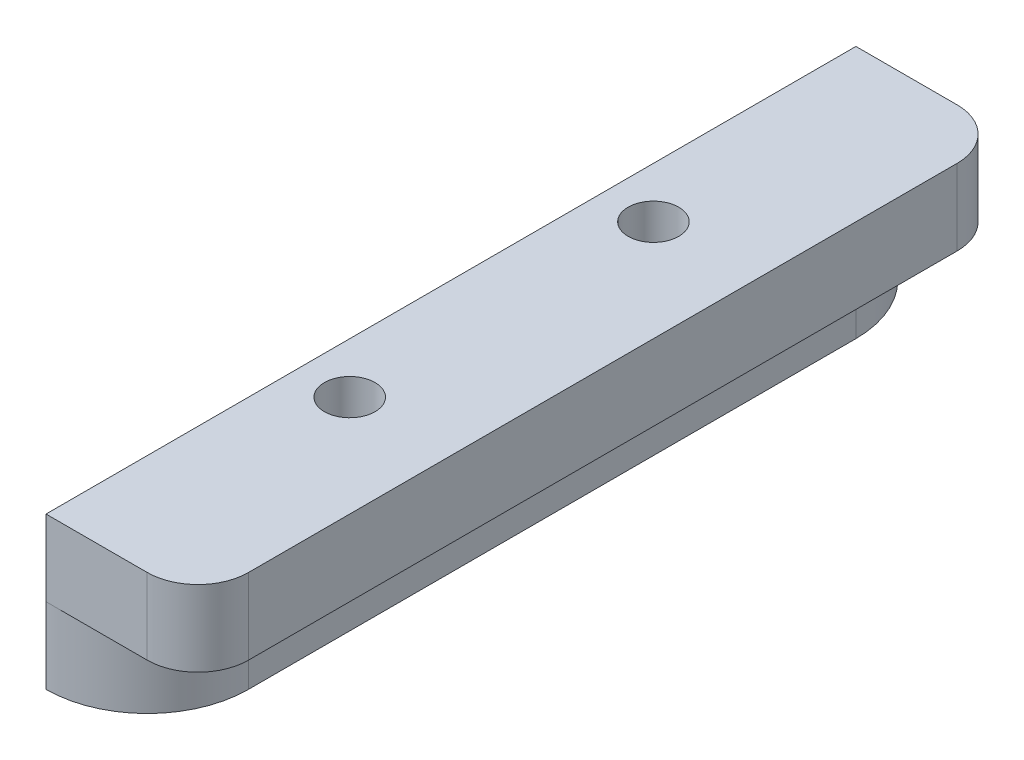
ISO-10303-21;
HEADER;
FILE_DESCRIPTION(('STEP AP214'),'2;1');
FILE_NAME('part.step','',(''),(''),'','','');
FILE_SCHEMA(('AUTOMOTIVE_DESIGN { 1 0 10303 214 1 1 1 1 }'));
ENDSEC;
DATA;
#1=APPLICATION_CONTEXT('core data for automotive mechanical design processes');
#2=APPLICATION_PROTOCOL_DEFINITION('international standard','automotive_design',2000,#1);
#3=PRODUCT_CONTEXT('',#1,'mechanical');
#4=PRODUCT('Part','Part','',(#3));
#5=PRODUCT_RELATED_PRODUCT_CATEGORY('part','',(#4));
#6=PRODUCT_DEFINITION_FORMATION('','',#4);
#7=PRODUCT_DEFINITION_CONTEXT('part definition',#1,'design');
#8=PRODUCT_DEFINITION('design','',#6,#7);
#9=PRODUCT_DEFINITION_SHAPE('','',#8);
#10=(LENGTH_UNIT() NAMED_UNIT(*) SI_UNIT(.MILLI.,.METRE.));
#11=(NAMED_UNIT(*) PLANE_ANGLE_UNIT() SI_UNIT($,.RADIAN.));
#12=(NAMED_UNIT(*) SI_UNIT($,.STERADIAN.) SOLID_ANGLE_UNIT());
#13=UNCERTAINTY_MEASURE_WITH_UNIT(LENGTH_MEASURE(1.E-05),#10,'distance_accuracy_value','');
#14=(GEOMETRIC_REPRESENTATION_CONTEXT(3) GLOBAL_UNCERTAINTY_ASSIGNED_CONTEXT((#13)) GLOBAL_UNIT_ASSIGNED_CONTEXT((#10,
#11,#12)) REPRESENTATION_CONTEXT('',''));
#15=CARTESIAN_POINT('',(0.,0.,0.));
#16=DIRECTION('',(0.,0.,1.));
#17=DIRECTION('',(1.,0.,0.));
#18=AXIS2_PLACEMENT_3D('',#15,#16,#17);
#19=CARTESIAN_POINT('',(-9.525,9.525,50.8));
#20=DIRECTION('',(0.,0.,-1.));
#21=DIRECTION('',(-1.,0.,0.));
#22=AXIS2_PLACEMENT_3D('',#19,#20,#21);
#23=PLANE('',#22);
#24=DIRECTION('',(-1.,0.,0.));
#25=VECTOR('',#24,1.);
#26=CARTESIAN_POINT('',(3.175,0.,50.8));
#27=LINE('',#26,#25);
#28=CARTESIAN_POINT('',(3.175,0.,50.8));
#29=VERTEX_POINT('',#28);
#30=CARTESIAN_POINT('',(-9.525,0.,50.8));
#31=VERTEX_POINT('',#30);
#32=EDGE_CURVE('E179',#29,#31,#27,.T.);
#33=ORIENTED_EDGE('',*,*,#32,.F.);
#34=DIRECTION('',(0.,-1.,0.));
#35=VECTOR('',#34,1.);
#36=CARTESIAN_POINT('',(3.175,9.525,50.8));
#37=LINE('',#36,#35);
#38=CARTESIAN_POINT('',(3.175,9.525,50.8));
#39=VERTEX_POINT('',#38);
#40=EDGE_CURVE('E11',#29,#39,#37,.F.);
#41=ORIENTED_EDGE('',*,*,#40,.T.);
#42=DIRECTION('',(1.,0.,0.));
#43=VECTOR('',#42,1.);
#44=CARTESIAN_POINT('',(-9.525,9.525,50.8));
#45=LINE('',#44,#43);
#46=CARTESIAN_POINT('',(-9.525,9.525,50.8));
#47=VERTEX_POINT('',#46);
#48=EDGE_CURVE('E146',#47,#39,#45,.T.);
#49=ORIENTED_EDGE('',*,*,#48,.F.);
#50=DIRECTION('',(0.,-1.,0.));
#51=VECTOR('',#50,1.);
#52=CARTESIAN_POINT('',(-9.525,9.525,50.8));
#53=LINE('',#52,#51);
#54=EDGE_CURVE('E137',#47,#31,#53,.T.);
#55=ORIENTED_EDGE('',*,*,#54,.T.);
#56=EDGE_LOOP('',(#33,#41,#49,#55));
#57=FACE_BOUND('',#56,.T.);
#58=ADVANCED_FACE('F37',(#57),#23,.F.);
#59=CARTESIAN_POINT('',(9.525,9.525,50.8));
#60=DIRECTION('',(-1.,0.,0.));
#61=DIRECTION('',(0.,0.,1.));
#62=AXIS2_PLACEMENT_3D('',#59,#60,#61);
#63=PLANE('',#62);
#64=DIRECTION('',(0.,0.,1.));
#65=VECTOR('',#64,1.);
#66=CARTESIAN_POINT('',(9.525,0.,-50.8));
#67=LINE('',#66,#65);
#68=CARTESIAN_POINT('',(9.525,0.,-44.45));
#69=VERTEX_POINT('',#68);
#70=CARTESIAN_POINT('',(9.525,0.,44.45));
#71=VERTEX_POINT('',#70);
#72=EDGE_CURVE('E180',#69,#71,#67,.T.);
#73=ORIENTED_EDGE('',*,*,#72,.F.);
#74=DIRECTION('',(0.,-1.,0.));
#75=VECTOR('',#74,1.);
#76=CARTESIAN_POINT('',(9.525,9.525,-44.45));
#77=LINE('',#76,#75);
#78=CARTESIAN_POINT('',(9.525,9.525,-44.45));
#79=VERTEX_POINT('',#78);
#80=EDGE_CURVE('E58',#69,#79,#77,.F.);
#81=ORIENTED_EDGE('',*,*,#80,.T.);
#82=DIRECTION('',(0.,0.,-1.));
#83=VECTOR('',#82,1.);
#84=CARTESIAN_POINT('',(9.525,9.525,50.8));
#85=LINE('',#84,#83);
#86=CARTESIAN_POINT('',(9.525,9.525,44.45));
#87=VERTEX_POINT('',#86);
#88=EDGE_CURVE('E131',#87,#79,#85,.T.);
#89=ORIENTED_EDGE('',*,*,#88,.F.);
#90=DIRECTION('',(0.,-1.,0.));
#91=VECTOR('',#90,1.);
#92=CARTESIAN_POINT('',(9.525,9.525,44.45));
#93=LINE('',#92,#91);
#94=EDGE_CURVE('E167',#87,#71,#93,.T.);
#95=ORIENTED_EDGE('',*,*,#94,.T.);
#96=EDGE_LOOP('',(#73,#81,#89,#95));
#97=FACE_BOUND('',#96,.T.);
#98=ADVANCED_FACE('F175',(#97),#63,.F.);
#99=CARTESIAN_POINT('',(-9.525,9.525,-50.8));
#100=DIRECTION('',(0.,0.,-1.));
#101=DIRECTION('',(-1.,0.,0.));
#102=AXIS2_PLACEMENT_3D('',#99,#100,#101);
#103=PLANE('',#102);
#104=DIRECTION('',(1.,0.,0.));
#105=VECTOR('',#104,1.);
#106=CARTESIAN_POINT('',(-9.525,9.525,-50.8));
#107=LINE('',#106,#105);
#108=CARTESIAN_POINT('',(-9.525,9.525,-50.8));
#109=VERTEX_POINT('',#108);
#110=CARTESIAN_POINT('',(3.175,9.525,-50.8));
#111=VERTEX_POINT('',#110);
#112=EDGE_CURVE('E114',#109,#111,#107,.T.);
#113=ORIENTED_EDGE('',*,*,#112,.T.);
#114=DIRECTION('',(0.,-1.,0.));
#115=VECTOR('',#114,1.);
#116=CARTESIAN_POINT('',(3.175,0.,-50.8));
#117=LINE('',#116,#115);
#118=CARTESIAN_POINT('',(3.175,0.,-50.8));
#119=VERTEX_POINT('',#118);
#120=EDGE_CURVE('E161',#111,#119,#117,.T.);
#121=ORIENTED_EDGE('',*,*,#120,.T.);
#122=DIRECTION('',(-1.,0.,0.));
#123=VECTOR('',#122,1.);
#124=CARTESIAN_POINT('',(3.175,0.,-50.8));
#125=LINE('',#124,#123);
#126=CARTESIAN_POINT('',(-9.525,0.,-50.8));
#127=VERTEX_POINT('',#126);
#128=EDGE_CURVE('E117',#119,#127,#125,.T.);
#129=ORIENTED_EDGE('',*,*,#128,.T.);
#130=DIRECTION('',(0.,-1.,0.));
#131=VECTOR('',#130,1.);
#132=CARTESIAN_POINT('',(-9.525,9.525,-50.8));
#133=LINE('',#132,#131);
#134=EDGE_CURVE('E110',#109,#127,#133,.T.);
#135=ORIENTED_EDGE('',*,*,#134,.F.);
#136=EDGE_LOOP('',(#113,#121,#129,#135));
#137=FACE_BOUND('',#136,.T.);
#138=ADVANCED_FACE('F112',(#137),#103,.T.);
#139=CARTESIAN_POINT('',(-9.525,9.525,50.8));
#140=DIRECTION('',(-1.,0.,0.));
#141=DIRECTION('',(0.,0.,1.));
#142=AXIS2_PLACEMENT_3D('',#139,#140,#141);
#143=PLANE('',#142);
#144=DIRECTION('',(0.,0.,-1.));
#145=VECTOR('',#144,1.);
#146=CARTESIAN_POINT('',(-9.525,-9.525,50.8));
#147=LINE('',#146,#145);
#148=CARTESIAN_POINT('',(-9.525,-9.525,50.8));
#149=VERTEX_POINT('',#148);
#150=CARTESIAN_POINT('',(-9.525,-9.525,-50.8));
#151=VERTEX_POINT('',#150);
#152=EDGE_CURVE('E144',#149,#151,#147,.T.);
#153=ORIENTED_EDGE('',*,*,#152,.F.);
#154=EDGE_CURVE('E138',#31,#149,#53,.T.);
#155=ORIENTED_EDGE('',*,*,#154,.F.);
#156=ORIENTED_EDGE('',*,*,#54,.F.);
#157=DIRECTION('',(0.,0.,-1.));
#158=VECTOR('',#157,1.);
#159=CARTESIAN_POINT('',(-9.525,9.525,50.8));
#160=LINE('',#159,#158);
#161=EDGE_CURVE('E129',#47,#109,#160,.T.);
#162=ORIENTED_EDGE('',*,*,#161,.T.);
#163=ORIENTED_EDGE('',*,*,#134,.T.);
#164=EDGE_CURVE('E124',#127,#151,#133,.T.);
#165=ORIENTED_EDGE('',*,*,#164,.T.);
#166=EDGE_LOOP('',(#153,#155,#156,#162,#163,#165));
#167=FACE_BOUND('',#166,.T.);
#168=ADVANCED_FACE('F134',(#167),#143,.T.);
#169=CARTESIAN_POINT('',(0.,9.525,0.));
#170=DIRECTION('',(0.,1.,0.));
#171=DIRECTION('',(0.,0.,1.));
#172=AXIS2_PLACEMENT_3D('',#169,#170,#171);
#173=PLANE('',#172);
#174=CARTESIAN_POINT('',(-3.17499999999999,9.525,-19.05));
#175=DIRECTION('',(0.,1.,0.));
#176=DIRECTION('',(0.,0.,1.));
#177=AXIS2_PLACEMENT_3D('',#174,#175,#176);
#178=CIRCLE('',#177,3.175);
#179=CARTESIAN_POINT('',(-3.17499999999999,9.525,-15.875));
#180=VERTEX_POINT('',#179);
#181=EDGE_CURVE('E334',#180,#180,#178,.T.);
#182=ORIENTED_EDGE('',*,*,#181,.F.);
#183=EDGE_LOOP('',(#182));
#184=FACE_BOUND('',#183,.T.);
#185=CARTESIAN_POINT('',(-3.17499999999999,9.525,19.05));
#186=DIRECTION('',(0.,1.,0.));
#187=DIRECTION('',(0.,0.,1.));
#188=AXIS2_PLACEMENT_3D('',#185,#186,#187);
#189=CIRCLE('',#188,3.175);
#190=CARTESIAN_POINT('',(-3.17499999999999,9.525,22.225));
#191=VERTEX_POINT('',#190);
#192=EDGE_CURVE('E186',#191,#191,#189,.T.);
#193=ORIENTED_EDGE('',*,*,#192,.F.);
#194=EDGE_LOOP('',(#193));
#195=FACE_BOUND('',#194,.T.);
#196=ORIENTED_EDGE('',*,*,#88,.T.);
#197=CARTESIAN_POINT('',(3.175,9.525,-44.45));
#198=DIRECTION('',(0.,1.,0.));
#199=DIRECTION('',(0.,0.,1.));
#200=AXIS2_PLACEMENT_3D('',#197,#198,#199);
#201=CIRCLE('',#200,6.35);
#202=EDGE_CURVE('E45',#79,#111,#201,.T.);
#203=ORIENTED_EDGE('',*,*,#202,.T.);
#204=ORIENTED_EDGE('',*,*,#112,.F.);
#205=ORIENTED_EDGE('',*,*,#161,.F.);
#206=ORIENTED_EDGE('',*,*,#48,.T.);
#207=CARTESIAN_POINT('',(3.175,9.525,44.45));
#208=DIRECTION('',(0.,1.,0.));
#209=DIRECTION('',(0.,0.,1.));
#210=AXIS2_PLACEMENT_3D('',#207,#208,#209);
#211=CIRCLE('',#210,6.35);
#212=EDGE_CURVE('E171',#39,#87,#211,.T.);
#213=ORIENTED_EDGE('',*,*,#212,.T.);
#214=EDGE_LOOP('',(#196,#203,#204,#205,#206,#213));
#215=FACE_BOUND('',#214,.T.);
#216=ADVANCED_FACE('F128',(#184,#195,#215),#173,.T.);
#217=CARTESIAN_POINT('',(0.,-9.525,0.));
#218=DIRECTION('',(0.,1.,0.));
#219=DIRECTION('',(0.,0.,1.));
#220=AXIS2_PLACEMENT_3D('',#217,#218,#219);
#221=PLANE('',#220);
#222=CARTESIAN_POINT('',(-3.17499999999999,-9.525,-19.05));
#223=DIRECTION('',(0.,1.,0.));
#224=DIRECTION('',(0.,0.,1.));
#225=AXIS2_PLACEMENT_3D('',#222,#223,#224);
#226=CIRCLE('',#225,3.175);
#227=CARTESIAN_POINT('',(-3.17499999999999,-9.525,-15.875));
#228=VERTEX_POINT('',#227);
#229=EDGE_CURVE('E331',#228,#228,#226,.T.);
#230=ORIENTED_EDGE('',*,*,#229,.T.);
#231=EDGE_LOOP('',(#230));
#232=FACE_BOUND('',#231,.T.);
#233=CARTESIAN_POINT('',(-3.17499999999999,-9.525,19.05));
#234=DIRECTION('',(0.,1.,0.));
#235=DIRECTION('',(0.,0.,1.));
#236=AXIS2_PLACEMENT_3D('',#233,#234,#235);
#237=CIRCLE('',#236,3.175);
#238=CARTESIAN_POINT('',(-3.17499999999999,-9.525,22.225));
#239=VERTEX_POINT('',#238);
#240=EDGE_CURVE('E182',#239,#239,#237,.T.);
#241=ORIENTED_EDGE('',*,*,#240,.T.);
#242=EDGE_LOOP('',(#241));
#243=FACE_BOUND('',#242,.T.);
#244=ORIENTED_EDGE('',*,*,#152,.T.);
#245=CARTESIAN_POINT('',(-9.525,-9.525,-38.1));
#246=DIRECTION('',(0.,1.,0.));
#247=DIRECTION('',(0.,0.,1.));
#248=AXIS2_PLACEMENT_3D('',#245,#246,#247);
#249=CIRCLE('',#248,12.7);
#250=CARTESIAN_POINT('',(3.175,-9.525,-38.1));
#251=VERTEX_POINT('',#250);
#252=EDGE_CURVE('E150',#151,#251,#249,.F.);
#253=ORIENTED_EDGE('',*,*,#252,.T.);
#254=DIRECTION('',(0.,0.,1.));
#255=VECTOR('',#254,1.);
#256=CARTESIAN_POINT('',(3.175,-9.525,-50.8));
#257=LINE('',#256,#255);
#258=CARTESIAN_POINT('',(3.175,-9.525,38.1));
#259=VERTEX_POINT('',#258);
#260=EDGE_CURVE('E147',#251,#259,#257,.T.);
#261=ORIENTED_EDGE('',*,*,#260,.T.);
#262=CARTESIAN_POINT('',(-9.525,-9.525,38.1));
#263=DIRECTION('',(0.,1.,0.));
#264=DIRECTION('',(0.,0.,1.));
#265=AXIS2_PLACEMENT_3D('',#262,#263,#264);
#266=CIRCLE('',#265,12.7);
#267=EDGE_CURVE('E123',#259,#149,#266,.F.);
#268=ORIENTED_EDGE('',*,*,#267,.T.);
#269=EDGE_LOOP('',(#244,#253,#261,#268));
#270=FACE_BOUND('',#269,.T.);
#271=ADVANCED_FACE('F205',(#232,#243,#270),#221,.F.);
#272=CARTESIAN_POINT('',(3.175,0.,-50.8));
#273=DIRECTION('',(-1.,0.,0.));
#274=DIRECTION('',(0.,-1.,0.));
#275=AXIS2_PLACEMENT_3D('',#272,#273,#274);
#276=PLANE('',#275);
#277=ORIENTED_EDGE('',*,*,#260,.F.);
#278=DIRECTION('',(0.,-1.,0.));
#279=VECTOR('',#278,1.);
#280=CARTESIAN_POINT('',(3.175,0.,-38.1));
#281=LINE('',#280,#279);
#282=CARTESIAN_POINT('',(3.175,0.,-38.1));
#283=VERTEX_POINT('',#282);
#284=EDGE_CURVE('E155',#251,#283,#281,.F.);
#285=ORIENTED_EDGE('',*,*,#284,.T.);
#286=DIRECTION('',(0.,0.,1.));
#287=VECTOR('',#286,1.);
#288=CARTESIAN_POINT('',(3.175,0.,-50.8));
#289=LINE('',#288,#287);
#290=CARTESIAN_POINT('',(3.175,0.,38.1));
#291=VERTEX_POINT('',#290);
#292=EDGE_CURVE('E191',#283,#291,#289,.T.);
#293=ORIENTED_EDGE('',*,*,#292,.T.);
#294=DIRECTION('',(0.,-1.,0.));
#295=VECTOR('',#294,1.);
#296=CARTESIAN_POINT('',(3.175,0.,38.1));
#297=LINE('',#296,#295);
#298=EDGE_CURVE('E152',#291,#259,#297,.T.);
#299=ORIENTED_EDGE('',*,*,#298,.T.);
#300=EDGE_LOOP('',(#277,#285,#293,#299));
#301=FACE_BOUND('',#300,.T.);
#302=ADVANCED_FACE('F199',(#301),#276,.F.);
#303=CARTESIAN_POINT('',(3.175,0.,-50.8));
#304=DIRECTION('',(0.,1.,0.));
#305=DIRECTION('',(-1.,0.,0.));
#306=AXIS2_PLACEMENT_3D('',#303,#304,#305);
#307=PLANE('',#306);
#308=ORIENTED_EDGE('',*,*,#128,.F.);
#309=CARTESIAN_POINT('',(3.175,0.,-44.45));
#310=DIRECTION('',(0.,1.,0.));
#311=DIRECTION('',(-1.,0.,0.));
#312=AXIS2_PLACEMENT_3D('',#309,#310,#311);
#313=CIRCLE('',#312,6.35);
#314=EDGE_CURVE('E165',#119,#69,#313,.F.);
#315=ORIENTED_EDGE('',*,*,#314,.T.);
#316=ORIENTED_EDGE('',*,*,#72,.T.);
#317=CARTESIAN_POINT('',(3.175,0.,44.45));
#318=DIRECTION('',(0.,1.,0.));
#319=DIRECTION('',(-1.,0.,0.));
#320=AXIS2_PLACEMENT_3D('',#317,#318,#319);
#321=CIRCLE('',#320,6.35);
#322=EDGE_CURVE('E163',#71,#29,#321,.F.);
#323=ORIENTED_EDGE('',*,*,#322,.T.);
#324=ORIENTED_EDGE('',*,*,#32,.T.);
#325=CARTESIAN_POINT('',(-9.525,0.,38.1));
#326=DIRECTION('',(0.,1.,0.));
#327=DIRECTION('',(-1.,0.,0.));
#328=AXIS2_PLACEMENT_3D('',#325,#326,#327);
#329=CIRCLE('',#328,12.7);
#330=EDGE_CURVE('E159',#31,#291,#329,.T.);
#331=ORIENTED_EDGE('',*,*,#330,.T.);
#332=ORIENTED_EDGE('',*,*,#292,.F.);
#333=CARTESIAN_POINT('',(-9.525,0.,-38.1));
#334=DIRECTION('',(0.,1.,0.));
#335=DIRECTION('',(-1.,0.,0.));
#336=AXIS2_PLACEMENT_3D('',#333,#334,#335);
#337=CIRCLE('',#336,12.7);
#338=EDGE_CURVE('E157',#283,#127,#337,.T.);
#339=ORIENTED_EDGE('',*,*,#338,.T.);
#340=EDGE_LOOP('',(#308,#315,#316,#323,#324,#331,#332,#339));
#341=FACE_BOUND('',#340,.T.);
#342=ADVANCED_FACE('F178',(#341),#307,.F.);
#343=CARTESIAN_POINT('',(-3.17499999999999,9.525,19.05));
#344=DIRECTION('',(0.,1.,0.));
#345=DIRECTION('',(0.,0.,1.));
#346=AXIS2_PLACEMENT_3D('',#343,#344,#345);
#347=CYLINDRICAL_SURFACE('',#346,3.175);
#348=ORIENTED_EDGE('',*,*,#192,.T.);
#349=EDGE_LOOP('',(#348));
#350=FACE_BOUND('',#349,.T.);
#351=ORIENTED_EDGE('',*,*,#240,.F.);
#352=EDGE_LOOP('',(#351));
#353=FACE_BOUND('',#352,.T.);
#354=ADVANCED_FACE('F229',(#350,#353),#347,.F.);
#355=CARTESIAN_POINT('',(-3.17499999999999,9.525,-19.05));
#356=DIRECTION('',(0.,1.,0.));
#357=DIRECTION('',(0.,0.,1.));
#358=AXIS2_PLACEMENT_3D('',#355,#356,#357);
#359=CYLINDRICAL_SURFACE('',#358,3.175);
#360=ORIENTED_EDGE('',*,*,#181,.T.);
#361=EDGE_LOOP('',(#360));
#362=FACE_BOUND('',#361,.T.);
#363=ORIENTED_EDGE('',*,*,#229,.F.);
#364=EDGE_LOOP('',(#363));
#365=FACE_BOUND('',#364,.T.);
#366=ADVANCED_FACE('F225',(#362,#365),#359,.F.);
#367=CARTESIAN_POINT('',(-9.525,9.525,-38.1));
#368=DIRECTION('',(0.,1.,0.));
#369=DIRECTION('',(-1.,0.,0.));
#370=AXIS2_PLACEMENT_3D('',#367,#368,#369);
#371=CYLINDRICAL_SURFACE('',#370,12.7);
#372=ORIENTED_EDGE('',*,*,#338,.F.);
#373=ORIENTED_EDGE('',*,*,#284,.F.);
#374=ORIENTED_EDGE('',*,*,#252,.F.);
#375=ORIENTED_EDGE('',*,*,#164,.F.);
#376=EDGE_LOOP('',(#372,#373,#374,#375));
#377=FACE_BOUND('',#376,.T.);
#378=ADVANCED_FACE('F207',(#377),#371,.T.);
#379=CARTESIAN_POINT('',(-9.525,0.,38.1));
#380=DIRECTION('',(0.,-1.,0.));
#381=DIRECTION('',(1.,0.,0.));
#382=AXIS2_PLACEMENT_3D('',#379,#380,#381);
#383=CYLINDRICAL_SURFACE('',#382,12.7);
#384=ORIENTED_EDGE('',*,*,#330,.F.);
#385=ORIENTED_EDGE('',*,*,#154,.T.);
#386=ORIENTED_EDGE('',*,*,#267,.F.);
#387=ORIENTED_EDGE('',*,*,#298,.F.);
#388=EDGE_LOOP('',(#384,#385,#386,#387));
#389=FACE_BOUND('',#388,.T.);
#390=ADVANCED_FACE('F203',(#389),#383,.T.);
#391=CARTESIAN_POINT('',(3.175,9.525,-44.45));
#392=DIRECTION('',(0.,1.,0.));
#393=DIRECTION('',(0.,0.,1.));
#394=AXIS2_PLACEMENT_3D('',#391,#392,#393);
#395=CYLINDRICAL_SURFACE('',#394,6.35);
#396=ORIENTED_EDGE('',*,*,#202,.F.);
#397=ORIENTED_EDGE('',*,*,#80,.F.);
#398=ORIENTED_EDGE('',*,*,#314,.F.);
#399=ORIENTED_EDGE('',*,*,#120,.F.);
#400=EDGE_LOOP('',(#396,#397,#398,#399));
#401=FACE_BOUND('',#400,.T.);
#402=ADVANCED_FACE('F209',(#401),#395,.T.);
#403=CARTESIAN_POINT('',(3.175,9.525,44.45));
#404=DIRECTION('',(0.,-1.,0.));
#405=DIRECTION('',(0.,0.,-1.));
#406=AXIS2_PLACEMENT_3D('',#403,#404,#405);
#407=CYLINDRICAL_SURFACE('',#406,6.35);
#408=ORIENTED_EDGE('',*,*,#212,.F.);
#409=ORIENTED_EDGE('',*,*,#40,.F.);
#410=ORIENTED_EDGE('',*,*,#322,.F.);
#411=ORIENTED_EDGE('',*,*,#94,.F.);
#412=EDGE_LOOP('',(#408,#409,#410,#411));
#413=FACE_BOUND('',#412,.T.);
#414=ADVANCED_FACE('F39',(#413),#407,.T.);
#415=CLOSED_SHELL('',(#58,#98,#138,#168,#216,#271,#302,#342,#354,#366,#378,#390,#402,#414));
#416=MANIFOLD_SOLID_BREP('B2',#415);
#417=ADVANCED_BREP_SHAPE_REPRESENTATION('',(#18,#416),#14);
#418=SHAPE_DEFINITION_REPRESENTATION(#9,#417);
ENDSEC;
END-ISO-10303-21;
